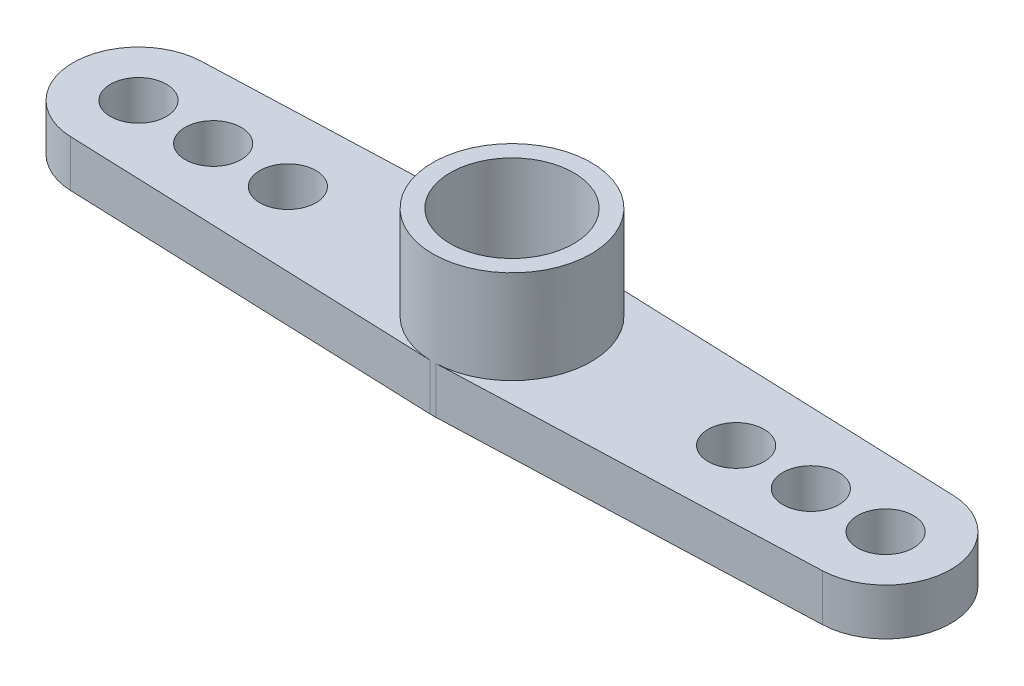
ISO-10303-21;
HEADER;
FILE_DESCRIPTION(('STEP AP214'),'2;1');
FILE_NAME('part.step','',(''),(''),'','','');
FILE_SCHEMA(('AUTOMOTIVE_DESIGN { 1 0 10303 214 1 1 1 1 }'));
ENDSEC;
DATA;
#1=APPLICATION_CONTEXT('core data for automotive mechanical design processes');
#2=APPLICATION_PROTOCOL_DEFINITION('international standard','automotive_design',2000,#1);
#3=PRODUCT_CONTEXT('',#1,'mechanical');
#4=PRODUCT('Part','Part','',(#3));
#5=PRODUCT_RELATED_PRODUCT_CATEGORY('part','',(#4));
#6=PRODUCT_DEFINITION_FORMATION('','',#4);
#7=PRODUCT_DEFINITION_CONTEXT('part definition',#1,'design');
#8=PRODUCT_DEFINITION('design','',#6,#7);
#9=PRODUCT_DEFINITION_SHAPE('','',#8);
#10=(LENGTH_UNIT() NAMED_UNIT(*) SI_UNIT(.MILLI.,.METRE.));
#11=(NAMED_UNIT(*) PLANE_ANGLE_UNIT() SI_UNIT($,.RADIAN.));
#12=(NAMED_UNIT(*) SI_UNIT($,.STERADIAN.) SOLID_ANGLE_UNIT());
#13=UNCERTAINTY_MEASURE_WITH_UNIT(LENGTH_MEASURE(1.E-05),#10,'distance_accuracy_value','');
#14=(GEOMETRIC_REPRESENTATION_CONTEXT(3) GLOBAL_UNCERTAINTY_ASSIGNED_CONTEXT((#13)) GLOBAL_UNIT_ASSIGNED_CONTEXT((#10,
#11,#12)) REPRESENTATION_CONTEXT('',''));
#15=CARTESIAN_POINT('',(0.,0.,0.));
#16=DIRECTION('',(0.,0.,1.));
#17=DIRECTION('',(1.,0.,0.));
#18=AXIS2_PLACEMENT_3D('',#15,#16,#17);
#19=CARTESIAN_POINT('',(0.,2.5,0.));
#20=DIRECTION('',(0.,1.,0.));
#21=DIRECTION('',(0.,0.,1.));
#22=AXIS2_PLACEMENT_3D('',#19,#20,#21);
#23=PLANE('',#22);
#24=CARTESIAN_POINT('',(0.,2.5,0.));
#25=DIRECTION('',(0.,1.,0.));
#26=DIRECTION('',(0.,0.,1.));
#27=AXIS2_PLACEMENT_3D('',#24,#25,#26);
#28=CIRCLE('',#27,4.23882826683749);
#29=CARTESIAN_POINT('',(0.156588307090462,2.5,4.23593498271905));
#30=VERTEX_POINT('',#29);
#31=CARTESIAN_POINT('',(0.156588307090493,2.5,-4.23593498271886));
#32=VERTEX_POINT('',#31);
#33=EDGE_CURVE('E117',#30,#32,#28,.T.);
#34=ORIENTED_EDGE('',*,*,#33,.F.);
#35=DIRECTION('',(-0.999317433041326,0.,0.0369414133418738));
#36=VECTOR('',#35,1.);
#37=CARTESIAN_POINT('',(0.15658830709046,2.5,4.235934982719));
#38=LINE('',#37,#36);
#39=CARTESIAN_POINT('',(20.129294946697,2.5,3.49761101564459));
#40=VERTEX_POINT('',#39);
#41=EDGE_CURVE('E225',#40,#30,#38,.T.);
#42=ORIENTED_EDGE('',*,*,#41,.F.);
#43=CARTESIAN_POINT('',(20.0000000000056,2.5,0.));
#44=DIRECTION('',(0.,1.,0.));
#45=DIRECTION('',(0.,0.,1.));
#46=AXIS2_PLACEMENT_3D('',#43,#44,#45);
#47=CIRCLE('',#46,3.4999999999996);
#48=CARTESIAN_POINT('',(20.1292949466965,2.5,-3.49761101564429));
#49=VERTEX_POINT('',#48);
#50=EDGE_CURVE('E139',#40,#49,#47,.T.);
#51=ORIENTED_EDGE('',*,*,#50,.T.);
#52=DIRECTION('',(-0.999317433041326,0.,-0.0369414133418827));
#53=VECTOR('',#52,1.);
#54=CARTESIAN_POINT('',(0.156588307090493,2.5,-4.23593498271886));
#55=LINE('',#54,#53);
#56=EDGE_CURVE('E133',#49,#32,#55,.T.);
#57=ORIENTED_EDGE('',*,*,#56,.T.);
#58=EDGE_LOOP('',(#34,#42,#51,#57));
#59=FACE_BOUND('',#58,.T.);
#60=CARTESIAN_POINT('',(20.0000000000051,2.5,0.));
#61=DIRECTION('',(0.,1.,0.));
#62=DIRECTION('',(0.,0.,1.));
#63=AXIS2_PLACEMENT_3D('',#60,#61,#62);
#64=CIRCLE('',#63,1.5000000000049);
#65=CARTESIAN_POINT('',(20.0000000000051,2.5,1.50000000000485));
#66=VERTEX_POINT('',#65);
#67=EDGE_CURVE('E261',#66,#66,#64,.T.);
#68=ORIENTED_EDGE('',*,*,#67,.F.);
#69=EDGE_LOOP('',(#68));
#70=FACE_BOUND('',#69,.T.);
#71=CARTESIAN_POINT('',(16.,2.5,1.09278109244686E-13));
#72=DIRECTION('',(0.,1.,0.));
#73=DIRECTION('',(0.,0.,1.));
#74=AXIS2_PLACEMENT_3D('',#71,#72,#73);
#75=CIRCLE('',#74,1.5);
#76=CARTESIAN_POINT('',(16.,2.5,1.50000000000011));
#77=VERTEX_POINT('',#76);
#78=EDGE_CURVE('E257',#77,#77,#75,.T.);
#79=ORIENTED_EDGE('',*,*,#78,.F.);
#80=EDGE_LOOP('',(#79));
#81=FACE_BOUND('',#80,.T.);
#82=CARTESIAN_POINT('',(12.,2.5,0.));
#83=DIRECTION('',(0.,1.,0.));
#84=DIRECTION('',(0.,0.,1.));
#85=AXIS2_PLACEMENT_3D('',#82,#83,#84);
#86=CIRCLE('',#85,1.5);
#87=CARTESIAN_POINT('',(12.,2.5,1.50000000000008));
#88=VERTEX_POINT('',#87);
#89=EDGE_CURVE('E253',#88,#88,#86,.T.);
#90=ORIENTED_EDGE('',*,*,#89,.F.);
#91=EDGE_LOOP('',(#90));
#92=FACE_BOUND('',#91,.T.);
#93=ADVANCED_FACE('F39',(#59,#70,#81,#92),#23,.T.);
#94=CARTESIAN_POINT('',(-0.156588307090489,2.5,4.23593498271905));
#95=DIRECTION('',(0.0369414133418802,0.,-0.999317433041326));
#96=DIRECTION('',(-0.999317433041326,0.,-0.0369414133418802));
#97=AXIS2_PLACEMENT_3D('',#94,#95,#96);
#98=PLANE('',#97);
#99=DIRECTION('',(0.999317433041326,0.,0.0369414133418802));
#100=VECTOR('',#99,1.);
#101=CARTESIAN_POINT('',(-0.156588307090489,0.,4.23593498271905));
#102=LINE('',#101,#100);
#103=CARTESIAN_POINT('',(-20.129294946696,0.,3.49761101564454));
#104=VERTEX_POINT('',#103);
#105=CARTESIAN_POINT('',(-0.156588307090489,0.,4.23593498271905));
#106=VERTEX_POINT('',#105);
#107=EDGE_CURVE('E168',#104,#106,#102,.T.);
#108=ORIENTED_EDGE('',*,*,#107,.T.);
#109=DIRECTION('',(0.,-1.,0.));
#110=VECTOR('',#109,1.);
#111=CARTESIAN_POINT('',(-0.156588307090489,2.5,4.23593498271905));
#112=LINE('',#111,#110);
#113=CARTESIAN_POINT('',(-0.156588307090489,2.5,4.23593498271905));
#114=VERTEX_POINT('',#113);
#115=EDGE_CURVE('E115',#114,#106,#112,.T.);
#116=ORIENTED_EDGE('',*,*,#115,.F.);
#117=DIRECTION('',(0.999317433041326,0.,0.0369414133418802));
#118=VECTOR('',#117,1.);
#119=CARTESIAN_POINT('',(-0.156588307090489,2.5,4.23593498271905));
#120=LINE('',#119,#118);
#121=CARTESIAN_POINT('',(-20.129294946696,2.5,3.49761101564454));
#122=VERTEX_POINT('',#121);
#123=EDGE_CURVE('E95',#122,#114,#120,.T.);
#124=ORIENTED_EDGE('',*,*,#123,.F.);
#125=DIRECTION('',(0.,-1.,0.));
#126=VECTOR('',#125,1.);
#127=CARTESIAN_POINT('',(-20.129294946696,2.5,3.49761101564454));
#128=LINE('',#127,#126);
#129=EDGE_CURVE('E137',#122,#104,#128,.T.);
#130=ORIENTED_EDGE('',*,*,#129,.T.);
#131=EDGE_LOOP('',(#108,#116,#124,#130));
#132=FACE_BOUND('',#131,.T.);
#133=ADVANCED_FACE('F213',(#132),#98,.F.);
#134=CARTESIAN_POINT('',(0.15658830709046,2.5,4.235934982719));
#135=DIRECTION('',(0.0369414133418738,0.,0.999317433041326));
#136=DIRECTION('',(0.999317433041326,0.,-0.0369414133418738));
#137=AXIS2_PLACEMENT_3D('',#134,#135,#136);
#138=PLANE('',#137);
#139=DIRECTION('',(-0.999317433041326,0.,0.0369414133418738));
#140=VECTOR('',#139,1.);
#141=CARTESIAN_POINT('',(0.15658830709046,0.,4.235934982719));
#142=LINE('',#141,#140);
#143=CARTESIAN_POINT('',(20.129294946697,0.,3.49761101564459));
#144=VERTEX_POINT('',#143);
#145=CARTESIAN_POINT('',(0.15658830709046,0.,4.235934982719));
#146=VERTEX_POINT('',#145);
#147=EDGE_CURVE('E176',#144,#146,#142,.T.);
#148=ORIENTED_EDGE('',*,*,#147,.F.);
#149=DIRECTION('',(0.,-1.,0.));
#150=VECTOR('',#149,1.);
#151=CARTESIAN_POINT('',(20.129294946697,2.5,3.49761101564459));
#152=LINE('',#151,#150);
#153=EDGE_CURVE('E204',#40,#144,#152,.T.);
#154=ORIENTED_EDGE('',*,*,#153,.F.);
#155=ORIENTED_EDGE('',*,*,#41,.T.);
#156=DIRECTION('',(0.,-1.,0.));
#157=VECTOR('',#156,1.);
#158=CARTESIAN_POINT('',(0.15658830709046,2.5,4.235934982719));
#159=LINE('',#158,#157);
#160=EDGE_CURVE('E207',#30,#146,#159,.T.);
#161=ORIENTED_EDGE('',*,*,#160,.T.);
#162=EDGE_LOOP('',(#148,#154,#155,#161));
#163=FACE_BOUND('',#162,.T.);
#164=ADVANCED_FACE('F221',(#163),#138,.T.);
#165=CARTESIAN_POINT('',(20.0000000000056,2.5,0.));
#166=DIRECTION('',(0.,-1.,0.));
#167=DIRECTION('',(0.,0.,-1.));
#168=AXIS2_PLACEMENT_3D('',#165,#166,#167);
#169=CYLINDRICAL_SURFACE('',#168,3.4999999999996);
#170=CARTESIAN_POINT('',(20.0000000000056,0.,0.));
#171=DIRECTION('',(0.,1.,0.));
#172=DIRECTION('',(0.,0.,1.));
#173=AXIS2_PLACEMENT_3D('',#170,#171,#172);
#174=CIRCLE('',#173,3.4999999999996);
#175=CARTESIAN_POINT('',(20.1292949466965,0.,-3.49761101564429));
#176=VERTEX_POINT('',#175);
#177=EDGE_CURVE('E180',#144,#176,#174,.T.);
#178=ORIENTED_EDGE('',*,*,#177,.T.);
#179=DIRECTION('',(0.,-1.,0.));
#180=VECTOR('',#179,1.);
#181=CARTESIAN_POINT('',(20.1292949466965,2.5,-3.49761101564429));
#182=LINE('',#181,#180);
#183=EDGE_CURVE('E200',#49,#176,#182,.T.);
#184=ORIENTED_EDGE('',*,*,#183,.F.);
#185=ORIENTED_EDGE('',*,*,#50,.F.);
#186=ORIENTED_EDGE('',*,*,#153,.T.);
#187=EDGE_LOOP('',(#178,#184,#185,#186));
#188=FACE_BOUND('',#187,.T.);
#189=ADVANCED_FACE('F271',(#188),#169,.T.);
#190=CARTESIAN_POINT('',(0.156588307090493,2.5,-4.23593498271886));
#191=DIRECTION('',(-0.0369414133418827,0.,0.999317433041326));
#192=DIRECTION('',(0.999317433041326,0.,0.0369414133418827));
#193=AXIS2_PLACEMENT_3D('',#190,#191,#192);
#194=PLANE('',#193);
#195=DIRECTION('',(-0.999317433041326,0.,-0.0369414133418827));
#196=VECTOR('',#195,1.);
#197=CARTESIAN_POINT('',(0.156588307090493,0.,-4.23593498271886));
#198=LINE('',#197,#196);
#199=CARTESIAN_POINT('',(0.156588307090493,0.,-4.23593498271886));
#200=VERTEX_POINT('',#199);
#201=EDGE_CURVE('E183',#176,#200,#198,.T.);
#202=ORIENTED_EDGE('',*,*,#201,.T.);
#203=DIRECTION('',(0.,-1.,0.));
#204=VECTOR('',#203,1.);
#205=CARTESIAN_POINT('',(0.156588307090493,2.5,-4.23593498271886));
#206=LINE('',#205,#204);
#207=EDGE_CURVE('E129',#32,#200,#206,.T.);
#208=ORIENTED_EDGE('',*,*,#207,.F.);
#209=ORIENTED_EDGE('',*,*,#56,.F.);
#210=ORIENTED_EDGE('',*,*,#183,.T.);
#211=EDGE_LOOP('',(#202,#208,#209,#210));
#212=FACE_BOUND('',#211,.T.);
#213=ADVANCED_FACE('F273',(#212),#194,.F.);
#214=CARTESIAN_POINT('',(0.,2.5,0.));
#215=DIRECTION('',(0.,-1.,0.));
#216=DIRECTION('',(0.,0.,-1.));
#217=AXIS2_PLACEMENT_3D('',#214,#215,#216);
#218=CYLINDRICAL_SURFACE('',#217,4.23882826683711);
#219=CARTESIAN_POINT('',(0.,0.,0.));
#220=DIRECTION('',(0.,1.,0.));
#221=DIRECTION('',(0.,0.,1.));
#222=AXIS2_PLACEMENT_3D('',#219,#220,#221);
#223=CIRCLE('',#222,4.23882826683711);
#224=CARTESIAN_POINT('',(-0.156588307090477,0.,-4.23593498271867));
#225=VERTEX_POINT('',#224);
#226=EDGE_CURVE('E124',#200,#225,#223,.T.);
#227=ORIENTED_EDGE('',*,*,#226,.T.);
#228=DIRECTION('',(0.,-1.,0.));
#229=VECTOR('',#228,1.);
#230=CARTESIAN_POINT('',(-0.156588307090477,2.5,-4.23593498271867));
#231=LINE('',#230,#229);
#232=CARTESIAN_POINT('',(-0.156588307090477,2.5,-4.23593498271867));
#233=VERTEX_POINT('',#232);
#234=EDGE_CURVE('E119',#233,#225,#231,.T.);
#235=ORIENTED_EDGE('',*,*,#234,.F.);
#236=EDGE_CURVE('E49',#233,#114,#28,.T.);
#237=ORIENTED_EDGE('',*,*,#236,.T.);
#238=ORIENTED_EDGE('',*,*,#115,.T.);
#239=CARTESIAN_POINT('',(0.,0.,0.));
#240=DIRECTION('',(0.,1.,0.));
#241=DIRECTION('',(0.,0.,1.));
#242=AXIS2_PLACEMENT_3D('',#239,#240,#241);
#243=CIRCLE('',#242,4.2388282668373);
#244=EDGE_CURVE('E172',#106,#146,#243,.T.);
#245=ORIENTED_EDGE('',*,*,#244,.T.);
#246=ORIENTED_EDGE('',*,*,#160,.F.);
#247=ORIENTED_EDGE('',*,*,#33,.T.);
#248=ORIENTED_EDGE('',*,*,#207,.T.);
#249=EDGE_LOOP('',(#227,#235,#237,#238,#245,#246,#247,#248));
#250=FACE_BOUND('',#249,.T.);
#251=CARTESIAN_POINT('',(0.,7.5,0.));
#252=DIRECTION('',(0.,1.,0.));
#253=DIRECTION('',(0.,0.,1.));
#254=AXIS2_PLACEMENT_3D('',#251,#252,#253);
#255=CIRCLE('',#254,4.23882826683749);
#256=CARTESIAN_POINT('',(0.,7.5,4.23882826683749));
#257=VERTEX_POINT('',#256);
#258=EDGE_CURVE('E148',#257,#257,#255,.T.);
#259=ORIENTED_EDGE('',*,*,#258,.F.);
#260=EDGE_LOOP('',(#259));
#261=FACE_BOUND('',#260,.T.);
#262=ADVANCED_FACE('F120',(#250,#261),#218,.T.);
#263=CARTESIAN_POINT('',(-0.156588307090477,2.5,-4.23593498271867));
#264=DIRECTION('',(-0.0369414133418806,0.,-0.999317433041326));
#265=DIRECTION('',(-0.999317433041326,0.,0.0369414133418806));
#266=AXIS2_PLACEMENT_3D('',#263,#264,#265);
#267=PLANE('',#266);
#268=DIRECTION('',(0.999317433041326,0.,-0.0369414133418806));
#269=VECTOR('',#268,1.);
#270=CARTESIAN_POINT('',(-0.156588307090477,0.,-4.23593498271867));
#271=LINE('',#270,#269);
#272=CARTESIAN_POINT('',(-20.1292949466966,0.,-3.49761101564414));
#273=VERTEX_POINT('',#272);
#274=EDGE_CURVE('E188',#273,#225,#271,.T.);
#275=ORIENTED_EDGE('',*,*,#274,.F.);
#276=DIRECTION('',(0.,-1.,0.));
#277=VECTOR('',#276,1.);
#278=CARTESIAN_POINT('',(-20.1292949466966,2.5,-3.49761101564414));
#279=LINE('',#278,#277);
#280=CARTESIAN_POINT('',(-20.1292949466966,2.5,-3.49761101564414));
#281=VERTEX_POINT('',#280);
#282=EDGE_CURVE('E86',#281,#273,#279,.T.);
#283=ORIENTED_EDGE('',*,*,#282,.F.);
#284=DIRECTION('',(0.999317433041326,0.,-0.0369414133418806));
#285=VECTOR('',#284,1.);
#286=CARTESIAN_POINT('',(-0.156588307090477,2.5,-4.23593498271867));
#287=LINE('',#286,#285);
#288=EDGE_CURVE('E111',#281,#233,#287,.T.);
#289=ORIENTED_EDGE('',*,*,#288,.T.);
#290=ORIENTED_EDGE('',*,*,#234,.T.);
#291=EDGE_LOOP('',(#275,#283,#289,#290));
#292=FACE_BOUND('',#291,.T.);
#293=ADVANCED_FACE('F131',(#292),#267,.T.);
#294=CARTESIAN_POINT('',(20.0000000000051,2.5,0.));
#295=DIRECTION('',(0.,-1.,0.));
#296=DIRECTION('',(0.,0.,-1.));
#297=AXIS2_PLACEMENT_3D('',#294,#295,#296);
#298=CYLINDRICAL_SURFACE('',#297,1.5000000000049);
#299=ORIENTED_EDGE('',*,*,#67,.T.);
#300=EDGE_LOOP('',(#299));
#301=FACE_BOUND('',#300,.T.);
#302=CARTESIAN_POINT('',(20.0000000000051,0.,0.));
#303=DIRECTION('',(0.,1.,0.));
#304=DIRECTION('',(0.,0.,1.));
#305=AXIS2_PLACEMENT_3D('',#302,#303,#304);
#306=CIRCLE('',#305,1.5000000000049);
#307=CARTESIAN_POINT('',(20.0000000000051,0.,1.50000000000485));
#308=VERTEX_POINT('',#307);
#309=EDGE_CURVE('E164',#308,#308,#306,.T.);
#310=ORIENTED_EDGE('',*,*,#309,.F.);
#311=EDGE_LOOP('',(#310));
#312=FACE_BOUND('',#311,.T.);
#313=ADVANCED_FACE('F306',(#301,#312),#298,.F.);
#314=CARTESIAN_POINT('',(16.,2.5,1.09278109244686E-13));
#315=DIRECTION('',(0.,-1.,0.));
#316=DIRECTION('',(0.,0.,-1.));
#317=AXIS2_PLACEMENT_3D('',#314,#315,#316);
#318=CYLINDRICAL_SURFACE('',#317,1.5);
#319=ORIENTED_EDGE('',*,*,#78,.T.);
#320=EDGE_LOOP('',(#319));
#321=FACE_BOUND('',#320,.T.);
#322=CARTESIAN_POINT('',(16.,0.,1.09278109244686E-13));
#323=DIRECTION('',(0.,1.,0.));
#324=DIRECTION('',(0.,0.,1.));
#325=AXIS2_PLACEMENT_3D('',#322,#323,#324);
#326=CIRCLE('',#325,1.5);
#327=CARTESIAN_POINT('',(16.,0.,1.50000000000011));
#328=VERTEX_POINT('',#327);
#329=EDGE_CURVE('E160',#328,#328,#326,.T.);
#330=ORIENTED_EDGE('',*,*,#329,.F.);
#331=EDGE_LOOP('',(#330));
#332=FACE_BOUND('',#331,.T.);
#333=ADVANCED_FACE('F310',(#321,#332),#318,.F.);
#334=CARTESIAN_POINT('',(12.,2.5,0.));
#335=DIRECTION('',(0.,-1.,0.));
#336=DIRECTION('',(0.,0.,-1.));
#337=AXIS2_PLACEMENT_3D('',#334,#335,#336);
#338=CYLINDRICAL_SURFACE('',#337,1.5);
#339=ORIENTED_EDGE('',*,*,#89,.T.);
#340=EDGE_LOOP('',(#339));
#341=FACE_BOUND('',#340,.T.);
#342=CARTESIAN_POINT('',(12.,0.,0.));
#343=DIRECTION('',(0.,1.,0.));
#344=DIRECTION('',(0.,0.,1.));
#345=AXIS2_PLACEMENT_3D('',#342,#343,#344);
#346=CIRCLE('',#345,1.5);
#347=CARTESIAN_POINT('',(12.,0.,1.50000000000008));
#348=VERTEX_POINT('',#347);
#349=EDGE_CURVE('E156',#348,#348,#346,.T.);
#350=ORIENTED_EDGE('',*,*,#349,.F.);
#351=EDGE_LOOP('',(#350));
#352=FACE_BOUND('',#351,.T.);
#353=ADVANCED_FACE('F316',(#341,#352),#338,.F.);
#354=CARTESIAN_POINT('',(-12.,2.5,0.));
#355=DIRECTION('',(0.,-1.,0.));
#356=DIRECTION('',(0.,0.,-1.));
#357=AXIS2_PLACEMENT_3D('',#354,#355,#356);
#358=CYLINDRICAL_SURFACE('',#357,1.5);
#359=CARTESIAN_POINT('',(-12.,2.5,0.));
#360=DIRECTION('',(0.,1.,0.));
#361=DIRECTION('',(0.,0.,1.));
#362=AXIS2_PLACEMENT_3D('',#359,#360,#361);
#363=CIRCLE('',#362,1.5);
#364=CARTESIAN_POINT('',(-12.,2.5,1.5));
#365=VERTEX_POINT('',#364);
#366=EDGE_CURVE('E249',#365,#365,#363,.T.);
#367=ORIENTED_EDGE('',*,*,#366,.T.);
#368=EDGE_LOOP('',(#367));
#369=FACE_BOUND('',#368,.T.);
#370=CARTESIAN_POINT('',(-12.,0.,0.));
#371=DIRECTION('',(0.,1.,0.));
#372=DIRECTION('',(0.,0.,1.));
#373=AXIS2_PLACEMENT_3D('',#370,#371,#372);
#374=CIRCLE('',#373,1.5);
#375=CARTESIAN_POINT('',(-12.,0.,1.5));
#376=VERTEX_POINT('',#375);
#377=EDGE_CURVE('E152',#376,#376,#374,.T.);
#378=ORIENTED_EDGE('',*,*,#377,.F.);
#379=EDGE_LOOP('',(#378));
#380=FACE_BOUND('',#379,.T.);
#381=ADVANCED_FACE('F324',(#369,#380),#358,.F.);
#382=CARTESIAN_POINT('',(-16.,2.5,0.));
#383=DIRECTION('',(0.,-1.,0.));
#384=DIRECTION('',(0.,0.,-1.));
#385=AXIS2_PLACEMENT_3D('',#382,#383,#384);
#386=CYLINDRICAL_SURFACE('',#385,1.5);
#387=CARTESIAN_POINT('',(-16.,2.5,0.));
#388=DIRECTION('',(0.,1.,0.));
#389=DIRECTION('',(0.,0.,1.));
#390=AXIS2_PLACEMENT_3D('',#387,#388,#389);
#391=CIRCLE('',#390,1.5);
#392=CARTESIAN_POINT('',(-16.,2.5,1.5));
#393=VERTEX_POINT('',#392);
#394=EDGE_CURVE('E245',#393,#393,#391,.T.);
#395=ORIENTED_EDGE('',*,*,#394,.T.);
#396=EDGE_LOOP('',(#395));
#397=FACE_BOUND('',#396,.T.);
#398=CARTESIAN_POINT('',(-16.,0.,0.));
#399=DIRECTION('',(0.,1.,0.));
#400=DIRECTION('',(0.,0.,1.));
#401=AXIS2_PLACEMENT_3D('',#398,#399,#400);
#402=CIRCLE('',#401,1.5);
#403=CARTESIAN_POINT('',(-16.,0.,1.5));
#404=VERTEX_POINT('',#403);
#405=EDGE_CURVE('E147',#404,#404,#402,.T.);
#406=ORIENTED_EDGE('',*,*,#405,.F.);
#407=EDGE_LOOP('',(#406));
#408=FACE_BOUND('',#407,.T.);
#409=ADVANCED_FACE('F328',(#397,#408),#386,.F.);
#410=CARTESIAN_POINT('',(-20.0000000000051,2.5,1.9193877379761E-13));
#411=DIRECTION('',(0.,-1.,0.));
#412=DIRECTION('',(0.,0.,-1.));
#413=AXIS2_PLACEMENT_3D('',#410,#411,#412);
#414=CYLINDRICAL_SURFACE('',#413,1.5000000000049);
#415=CARTESIAN_POINT('',(-20.0000000000051,2.5,1.9193877379761E-13));
#416=DIRECTION('',(0.,1.,0.));
#417=DIRECTION('',(0.,0.,1.));
#418=AXIS2_PLACEMENT_3D('',#415,#416,#417);
#419=CIRCLE('',#418,1.5000000000049);
#420=CARTESIAN_POINT('',(-20.0000000000051,2.5,1.50000000000509));
#421=VERTEX_POINT('',#420);
#422=EDGE_CURVE('E193',#421,#421,#419,.T.);
#423=ORIENTED_EDGE('',*,*,#422,.T.);
#424=EDGE_LOOP('',(#423));
#425=FACE_BOUND('',#424,.T.);
#426=CARTESIAN_POINT('',(-20.0000000000051,0.,1.9193877379761E-13));
#427=DIRECTION('',(0.,1.,0.));
#428=DIRECTION('',(0.,0.,1.));
#429=AXIS2_PLACEMENT_3D('',#426,#427,#428);
#430=CIRCLE('',#429,1.5000000000049);
#431=CARTESIAN_POINT('',(-20.0000000000051,0.,1.50000000000509));
#432=VERTEX_POINT('',#431);
#433=EDGE_CURVE('E143',#432,#432,#430,.T.);
#434=ORIENTED_EDGE('',*,*,#433,.F.);
#435=EDGE_LOOP('',(#434));
#436=FACE_BOUND('',#435,.T.);
#437=ADVANCED_FACE('F302',(#425,#436),#414,.F.);
#438=CARTESIAN_POINT('',(0.,2.5,0.));
#439=DIRECTION('',(0.,-1.,0.));
#440=DIRECTION('',(0.,0.,-1.));
#441=AXIS2_PLACEMENT_3D('',#438,#439,#440);
#442=CYLINDRICAL_SURFACE('',#441,3.3);
#443=CARTESIAN_POINT('',(0.,2.5,0.));
#444=DIRECTION('',(0.,1.,0.));
#445=DIRECTION('',(0.,0.,1.));
#446=AXIS2_PLACEMENT_3D('',#443,#444,#445);
#447=CIRCLE('',#446,3.3);
#448=CARTESIAN_POINT('',(0.,2.5,3.3));
#449=VERTEX_POINT('',#448);
#450=EDGE_CURVE('E11',#449,#449,#447,.T.);
#451=ORIENTED_EDGE('',*,*,#450,.F.);
#452=EDGE_LOOP('',(#451));
#453=FACE_BOUND('',#452,.T.);
#454=CARTESIAN_POINT('',(0.,7.5,0.));
#455=DIRECTION('',(0.,1.,0.));
#456=DIRECTION('',(0.,0.,1.));
#457=AXIS2_PLACEMENT_3D('',#454,#455,#456);
#458=CIRCLE('',#457,3.3);
#459=CARTESIAN_POINT('',(0.,7.5,3.3));
#460=VERTEX_POINT('',#459);
#461=EDGE_CURVE('E233',#460,#460,#458,.T.);
#462=ORIENTED_EDGE('',*,*,#461,.T.);
#463=EDGE_LOOP('',(#462));
#464=FACE_BOUND('',#463,.T.);
#465=ADVANCED_FACE('F41',(#453,#464),#442,.F.);
#466=CARTESIAN_POINT('',(-20.0000000000051,2.5,1.9193877379761E-13));
#467=DIRECTION('',(0.,-1.,0.));
#468=DIRECTION('',(0.,0.,-1.));
#469=AXIS2_PLACEMENT_3D('',#466,#467,#468);
#470=CYLINDRICAL_SURFACE('',#469,3.49999999999951);
#471=CARTESIAN_POINT('',(-20.0000000000051,0.,1.9193877379761E-13));
#472=DIRECTION('',(0.,1.,0.));
#473=DIRECTION('',(0.,0.,1.));
#474=AXIS2_PLACEMENT_3D('',#471,#472,#473);
#475=CIRCLE('',#474,3.49999999999951);
#476=EDGE_CURVE('E89',#273,#104,#475,.T.);
#477=ORIENTED_EDGE('',*,*,#476,.T.);
#478=ORIENTED_EDGE('',*,*,#129,.F.);
#479=CARTESIAN_POINT('',(-20.0000000000051,2.5,1.9193877379761E-13));
#480=DIRECTION('',(0.,1.,0.));
#481=DIRECTION('',(0.,0.,1.));
#482=AXIS2_PLACEMENT_3D('',#479,#480,#481);
#483=CIRCLE('',#482,3.49999999999951);
#484=EDGE_CURVE('E57',#281,#122,#483,.T.);
#485=ORIENTED_EDGE('',*,*,#484,.F.);
#486=ORIENTED_EDGE('',*,*,#282,.T.);
#487=EDGE_LOOP('',(#477,#478,#485,#486));
#488=FACE_BOUND('',#487,.T.);
#489=ADVANCED_FACE('F291',(#488),#470,.T.);
#490=ORIENTED_EDGE('',*,*,#236,.F.);
#491=ORIENTED_EDGE('',*,*,#288,.F.);
#492=ORIENTED_EDGE('',*,*,#484,.T.);
#493=ORIENTED_EDGE('',*,*,#123,.T.);
#494=EDGE_LOOP('',(#490,#491,#492,#493));
#495=FACE_BOUND('',#494,.T.);
#496=ORIENTED_EDGE('',*,*,#422,.F.);
#497=EDGE_LOOP('',(#496));
#498=FACE_BOUND('',#497,.T.);
#499=ORIENTED_EDGE('',*,*,#394,.F.);
#500=EDGE_LOOP('',(#499));
#501=FACE_BOUND('',#500,.T.);
#502=ORIENTED_EDGE('',*,*,#366,.F.);
#503=EDGE_LOOP('',(#502));
#504=FACE_BOUND('',#503,.T.);
#505=ADVANCED_FACE('F108',(#495,#498,#501,#504),#23,.T.);
#506=CARTESIAN_POINT('',(0.,0.,0.));
#507=DIRECTION('',(0.,1.,0.));
#508=DIRECTION('',(0.,0.,1.));
#509=AXIS2_PLACEMENT_3D('',#506,#507,#508);
#510=PLANE('',#509);
#511=ORIENTED_EDGE('',*,*,#433,.T.);
#512=EDGE_LOOP('',(#511));
#513=FACE_BOUND('',#512,.T.);
#514=ORIENTED_EDGE('',*,*,#405,.T.);
#515=EDGE_LOOP('',(#514));
#516=FACE_BOUND('',#515,.T.);
#517=ORIENTED_EDGE('',*,*,#377,.T.);
#518=EDGE_LOOP('',(#517));
#519=FACE_BOUND('',#518,.T.);
#520=ORIENTED_EDGE('',*,*,#349,.T.);
#521=EDGE_LOOP('',(#520));
#522=FACE_BOUND('',#521,.T.);
#523=ORIENTED_EDGE('',*,*,#329,.T.);
#524=EDGE_LOOP('',(#523));
#525=FACE_BOUND('',#524,.T.);
#526=ORIENTED_EDGE('',*,*,#309,.T.);
#527=EDGE_LOOP('',(#526));
#528=FACE_BOUND('',#527,.T.);
#529=ORIENTED_EDGE('',*,*,#107,.F.);
#530=ORIENTED_EDGE('',*,*,#476,.F.);
#531=ORIENTED_EDGE('',*,*,#274,.T.);
#532=ORIENTED_EDGE('',*,*,#226,.F.);
#533=ORIENTED_EDGE('',*,*,#201,.F.);
#534=ORIENTED_EDGE('',*,*,#177,.F.);
#535=ORIENTED_EDGE('',*,*,#147,.T.);
#536=ORIENTED_EDGE('',*,*,#244,.F.);
#537=EDGE_LOOP('',(#529,#530,#531,#532,#533,#534,#535,#536));
#538=FACE_BOUND('',#537,.T.);
#539=CARTESIAN_POINT('',(0.,0.,0.));
#540=DIRECTION('',(0.,1.,0.));
#541=DIRECTION('',(0.,0.,1.));
#542=AXIS2_PLACEMENT_3D('',#539,#540,#541);
#543=CIRCLE('',#542,1.5);
#544=CARTESIAN_POINT('',(0.,0.,1.5));
#545=VERTEX_POINT('',#544);
#546=EDGE_CURVE('E239',#545,#545,#543,.T.);
#547=ORIENTED_EDGE('',*,*,#546,.T.);
#548=EDGE_LOOP('',(#547));
#549=FACE_BOUND('',#548,.T.);
#550=ADVANCED_FACE('F215',(#513,#516,#519,#522,#525,#528,#538,#549),#510,.F.);
#551=CARTESIAN_POINT('',(0.,7.5,0.));
#552=DIRECTION('',(0.,1.,0.));
#553=DIRECTION('',(0.,0.,1.));
#554=AXIS2_PLACEMENT_3D('',#551,#552,#553);
#555=PLANE('',#554);
#556=ORIENTED_EDGE('',*,*,#258,.T.);
#557=EDGE_LOOP('',(#556));
#558=FACE_BOUND('',#557,.T.);
#559=ORIENTED_EDGE('',*,*,#461,.F.);
#560=EDGE_LOOP('',(#559));
#561=FACE_BOUND('',#560,.T.);
#562=ADVANCED_FACE('F296',(#558,#561),#555,.T.);
#563=CARTESIAN_POINT('',(0.,2.5,0.));
#564=DIRECTION('',(0.,1.,0.));
#565=DIRECTION('',(0.,0.,1.));
#566=AXIS2_PLACEMENT_3D('',#563,#564,#565);
#567=PLANE('',#566);
#568=CARTESIAN_POINT('',(0.,2.5,0.));
#569=DIRECTION('',(0.,1.,0.));
#570=DIRECTION('',(0.,0.,1.));
#571=AXIS2_PLACEMENT_3D('',#568,#569,#570);
#572=CIRCLE('',#571,1.5);
#573=CARTESIAN_POINT('',(0.,2.5,1.5));
#574=VERTEX_POINT('',#573);
#575=EDGE_CURVE('E411',#574,#574,#572,.T.);
#576=ORIENTED_EDGE('',*,*,#575,.F.);
#577=EDGE_LOOP('',(#576));
#578=FACE_BOUND('',#577,.T.);
#579=ORIENTED_EDGE('',*,*,#450,.T.);
#580=EDGE_LOOP('',(#579));
#581=FACE_BOUND('',#580,.T.);
#582=ADVANCED_FACE('F382',(#578,#581),#567,.T.);
#583=CARTESIAN_POINT('',(0.,0.,0.));
#584=DIRECTION('',(0.,1.,0.));
#585=DIRECTION('',(0.,0.,1.));
#586=AXIS2_PLACEMENT_3D('',#583,#584,#585);
#587=CYLINDRICAL_SURFACE('',#586,1.5);
#588=ORIENTED_EDGE('',*,*,#546,.F.);
#589=EDGE_LOOP('',(#588));
#590=FACE_BOUND('',#589,.T.);
#591=ORIENTED_EDGE('',*,*,#575,.T.);
#592=EDGE_LOOP('',(#591));
#593=FACE_BOUND('',#592,.T.);
#594=ADVANCED_FACE('F386',(#590,#593),#587,.F.);
#595=CLOSED_SHELL('',(#93,#133,#164,#189,#213,#262,#293,#313,#333,#353,#381,#409,#437,#465,#489,
#505,#550,#562,#582,#594));
#596=MANIFOLD_SOLID_BREP('B2',#595);
#597=ADVANCED_BREP_SHAPE_REPRESENTATION('',(#18,#596),#14);
#598=SHAPE_DEFINITION_REPRESENTATION(#9,#597);
ENDSEC;
END-ISO-10303-21;
